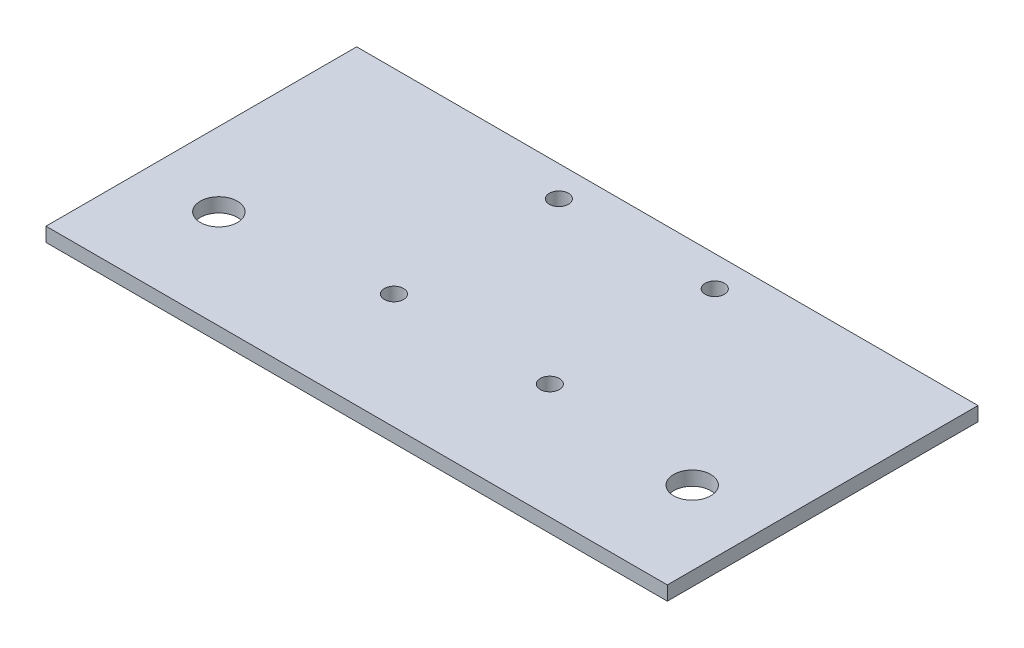
ISO-10303-21;
HEADER;
FILE_DESCRIPTION(('STEP AP214'),'2;1');
FILE_NAME('part.step','',(''),(''),'','','');
FILE_SCHEMA(('AUTOMOTIVE_DESIGN { 1 0 10303 214 1 1 1 1 }'));
ENDSEC;
DATA;
#1=APPLICATION_CONTEXT('core data for automotive mechanical design processes');
#2=APPLICATION_PROTOCOL_DEFINITION('international standard','automotive_design',2000,#1);
#3=PRODUCT_CONTEXT('',#1,'mechanical');
#4=PRODUCT('Part','Part','',(#3));
#5=PRODUCT_RELATED_PRODUCT_CATEGORY('part','',(#4));
#6=PRODUCT_DEFINITION_FORMATION('','',#4);
#7=PRODUCT_DEFINITION_CONTEXT('part definition',#1,'design');
#8=PRODUCT_DEFINITION('design','',#6,#7);
#9=PRODUCT_DEFINITION_SHAPE('','',#8);
#10=(LENGTH_UNIT() NAMED_UNIT(*) SI_UNIT(.MILLI.,.METRE.));
#11=(NAMED_UNIT(*) PLANE_ANGLE_UNIT() SI_UNIT($,.RADIAN.));
#12=(NAMED_UNIT(*) SI_UNIT($,.STERADIAN.) SOLID_ANGLE_UNIT());
#13=UNCERTAINTY_MEASURE_WITH_UNIT(LENGTH_MEASURE(1.E-05),#10,'distance_accuracy_value','');
#14=(GEOMETRIC_REPRESENTATION_CONTEXT(3) GLOBAL_UNCERTAINTY_ASSIGNED_CONTEXT((#13)) GLOBAL_UNIT_ASSIGNED_CONTEXT((#10,
#11,#12)) REPRESENTATION_CONTEXT('',''));
#15=CARTESIAN_POINT('',(0.,0.,0.));
#16=DIRECTION('',(0.,0.,1.));
#17=DIRECTION('',(1.,0.,0.));
#18=AXIS2_PLACEMENT_3D('',#15,#16,#17);
#19=CARTESIAN_POINT('',(0.,3.175,0.));
#20=DIRECTION('',(0.,1.,0.));
#21=DIRECTION('',(0.,0.,1.));
#22=AXIS2_PLACEMENT_3D('',#19,#20,#21);
#23=PLANE('',#22);
#24=CARTESIAN_POINT('',(-35.687,3.175,40.767));
#25=DIRECTION('',(0.,1.,0.));
#26=DIRECTION('',(0.,0.,1.));
#27=AXIS2_PLACEMENT_3D('',#24,#25,#26);
#28=CIRCLE('',#27,4.1656);
#29=CARTESIAN_POINT('',(-35.687,3.175,44.9326));
#30=VERTEX_POINT('',#29);
#31=EDGE_CURVE('E137',#30,#30,#28,.T.);
#32=ORIENTED_EDGE('',*,*,#31,.F.);
#33=EDGE_LOOP('',(#32));
#34=FACE_BOUND('',#33,.T.);
#35=CARTESIAN_POINT('',(0.,3.175,37.084));
#36=DIRECTION('',(0.,1.,0.));
#37=DIRECTION('',(0.,0.,1.));
#38=AXIS2_PLACEMENT_3D('',#35,#36,#37);
#39=CIRCLE('',#38,2.159);
#40=CARTESIAN_POINT('',(0.,3.175,39.243));
#41=VERTEX_POINT('',#40);
#42=EDGE_CURVE('E125',#41,#41,#39,.T.);
#43=ORIENTED_EDGE('',*,*,#42,.F.);
#44=EDGE_LOOP('',(#43));
#45=FACE_BOUND('',#44,.T.);
#46=CARTESIAN_POINT('',(0.,3.175,0.));
#47=DIRECTION('',(0.,1.,0.));
#48=DIRECTION('',(0.,0.,1.));
#49=AXIS2_PLACEMENT_3D('',#46,#47,#48);
#50=CIRCLE('',#49,2.159);
#51=CARTESIAN_POINT('',(0.,3.175,2.159));
#52=VERTEX_POINT('',#51);
#53=EDGE_CURVE('E104',#52,#52,#50,.T.);
#54=ORIENTED_EDGE('',*,*,#53,.F.);
#55=EDGE_LOOP('',(#54));
#56=FACE_BOUND('',#55,.T.);
#57=DIRECTION('',(0.,0.,1.));
#58=VECTOR('',#57,1.);
#59=CARTESIAN_POINT('',(-52.324,3.175,-6.858));
#60=LINE('',#59,#58);
#61=CARTESIAN_POINT('',(-52.324,3.175,-6.858));
#62=VERTEX_POINT('',#61);
#63=CARTESIAN_POINT('',(-52.324,3.175,62.992));
#64=VERTEX_POINT('',#63);
#65=EDGE_CURVE('E89',#62,#64,#60,.T.);
#66=ORIENTED_EDGE('',*,*,#65,.T.);
#67=DIRECTION('',(1.,0.,0.));
#68=VECTOR('',#67,1.);
#69=CARTESIAN_POINT('',(-52.324,3.175,62.992));
#70=LINE('',#69,#68);
#71=CARTESIAN_POINT('',(87.376,3.175,62.992));
#72=VERTEX_POINT('',#71);
#73=EDGE_CURVE('E84',#64,#72,#70,.T.);
#74=ORIENTED_EDGE('',*,*,#73,.T.);
#75=DIRECTION('',(0.,0.,-1.));
#76=VECTOR('',#75,1.);
#77=CARTESIAN_POINT('',(87.376,3.175,-6.858));
#78=LINE('',#77,#76);
#79=CARTESIAN_POINT('',(87.376,3.175,-6.858));
#80=VERTEX_POINT('',#79);
#81=EDGE_CURVE('E87',#72,#80,#78,.T.);
#82=ORIENTED_EDGE('',*,*,#81,.T.);
#83=DIRECTION('',(-1.,0.,0.));
#84=VECTOR('',#83,1.);
#85=CARTESIAN_POINT('',(-52.324,3.175,-6.858));
#86=LINE('',#85,#84);
#87=EDGE_CURVE('E54',#80,#62,#86,.T.);
#88=ORIENTED_EDGE('',*,*,#87,.T.);
#89=EDGE_LOOP('',(#66,#74,#82,#88));
#90=FACE_BOUND('',#89,.T.);
#91=CARTESIAN_POINT('',(35.052,3.175,0.));
#92=DIRECTION('',(0.,1.,0.));
#93=DIRECTION('',(0.,0.,1.));
#94=AXIS2_PLACEMENT_3D('',#91,#92,#93);
#95=CIRCLE('',#94,2.159);
#96=CARTESIAN_POINT('',(35.052,3.175,2.159));
#97=VERTEX_POINT('',#96);
#98=EDGE_CURVE('E119',#97,#97,#95,.T.);
#99=ORIENTED_EDGE('',*,*,#98,.F.);
#100=EDGE_LOOP('',(#99));
#101=FACE_BOUND('',#100,.T.);
#102=CARTESIAN_POINT('',(35.052,3.175,37.084));
#103=DIRECTION('',(0.,1.,0.));
#104=DIRECTION('',(0.,0.,1.));
#105=AXIS2_PLACEMENT_3D('',#102,#103,#104);
#106=CIRCLE('',#105,2.159);
#107=CARTESIAN_POINT('',(35.052,3.175,39.243));
#108=VERTEX_POINT('',#107);
#109=EDGE_CURVE('E131',#108,#108,#106,.T.);
#110=ORIENTED_EDGE('',*,*,#109,.F.);
#111=EDGE_LOOP('',(#110));
#112=FACE_BOUND('',#111,.T.);
#113=CARTESIAN_POINT('',(70.739,3.175,40.767));
#114=DIRECTION('',(0.,1.,0.));
#115=DIRECTION('',(0.,0.,1.));
#116=AXIS2_PLACEMENT_3D('',#113,#114,#115);
#117=CIRCLE('',#116,4.1656);
#118=CARTESIAN_POINT('',(70.739,3.175,44.9326));
#119=VERTEX_POINT('',#118);
#120=EDGE_CURVE('E143',#119,#119,#117,.T.);
#121=ORIENTED_EDGE('',*,*,#120,.F.);
#122=EDGE_LOOP('',(#121));
#123=FACE_BOUND('',#122,.T.);
#124=ADVANCED_FACE('F37',(#34,#45,#56,#90,#101,#112,#123),#23,.T.);
#125=CARTESIAN_POINT('',(0.,0.,0.));
#126=DIRECTION('',(0.,1.,0.));
#127=DIRECTION('',(0.,0.,1.));
#128=AXIS2_PLACEMENT_3D('',#125,#126,#127);
#129=PLANE('',#128);
#130=DIRECTION('',(0.,0.,1.));
#131=VECTOR('',#130,1.);
#132=CARTESIAN_POINT('',(-52.324,0.,-6.858));
#133=LINE('',#132,#131);
#134=CARTESIAN_POINT('',(-52.324,0.,-6.858));
#135=VERTEX_POINT('',#134);
#136=CARTESIAN_POINT('',(-52.324,0.,62.992));
#137=VERTEX_POINT('',#136);
#138=EDGE_CURVE('E101',#135,#137,#133,.T.);
#139=ORIENTED_EDGE('',*,*,#138,.F.);
#140=DIRECTION('',(-1.,0.,0.));
#141=VECTOR('',#140,1.);
#142=CARTESIAN_POINT('',(-52.324,0.,-6.858));
#143=LINE('',#142,#141);
#144=CARTESIAN_POINT('',(87.376,0.,-6.858));
#145=VERTEX_POINT('',#144);
#146=EDGE_CURVE('E77',#145,#135,#143,.T.);
#147=ORIENTED_EDGE('',*,*,#146,.F.);
#148=DIRECTION('',(0.,0.,-1.));
#149=VECTOR('',#148,1.);
#150=CARTESIAN_POINT('',(87.376,0.,-6.858));
#151=LINE('',#150,#149);
#152=CARTESIAN_POINT('',(87.376,0.,62.992));
#153=VERTEX_POINT('',#152);
#154=EDGE_CURVE('E71',#153,#145,#151,.T.);
#155=ORIENTED_EDGE('',*,*,#154,.F.);
#156=DIRECTION('',(1.,0.,0.));
#157=VECTOR('',#156,1.);
#158=CARTESIAN_POINT('',(-52.324,0.,62.992));
#159=LINE('',#158,#157);
#160=EDGE_CURVE('E93',#137,#153,#159,.T.);
#161=ORIENTED_EDGE('',*,*,#160,.F.);
#162=EDGE_LOOP('',(#139,#147,#155,#161));
#163=FACE_BOUND('',#162,.T.);
#164=CARTESIAN_POINT('',(0.,0.,0.));
#165=DIRECTION('',(0.,1.,0.));
#166=DIRECTION('',(0.,0.,1.));
#167=AXIS2_PLACEMENT_3D('',#164,#165,#166);
#168=CIRCLE('',#167,2.159);
#169=CARTESIAN_POINT('',(0.,0.,2.159));
#170=VERTEX_POINT('',#169);
#171=EDGE_CURVE('E116',#170,#170,#168,.T.);
#172=ORIENTED_EDGE('',*,*,#171,.T.);
#173=EDGE_LOOP('',(#172));
#174=FACE_BOUND('',#173,.T.);
#175=CARTESIAN_POINT('',(35.052,0.,0.));
#176=DIRECTION('',(0.,1.,0.));
#177=DIRECTION('',(0.,0.,1.));
#178=AXIS2_PLACEMENT_3D('',#175,#176,#177);
#179=CIRCLE('',#178,2.159);
#180=CARTESIAN_POINT('',(35.052,0.,2.159));
#181=VERTEX_POINT('',#180);
#182=EDGE_CURVE('E122',#181,#181,#179,.T.);
#183=ORIENTED_EDGE('',*,*,#182,.T.);
#184=EDGE_LOOP('',(#183));
#185=FACE_BOUND('',#184,.T.);
#186=CARTESIAN_POINT('',(0.,0.,37.084));
#187=DIRECTION('',(0.,1.,0.));
#188=DIRECTION('',(0.,0.,1.));
#189=AXIS2_PLACEMENT_3D('',#186,#187,#188);
#190=CIRCLE('',#189,2.159);
#191=CARTESIAN_POINT('',(0.,0.,39.243));
#192=VERTEX_POINT('',#191);
#193=EDGE_CURVE('E128',#192,#192,#190,.T.);
#194=ORIENTED_EDGE('',*,*,#193,.T.);
#195=EDGE_LOOP('',(#194));
#196=FACE_BOUND('',#195,.T.);
#197=CARTESIAN_POINT('',(35.052,0.,37.084));
#198=DIRECTION('',(0.,1.,0.));
#199=DIRECTION('',(0.,0.,1.));
#200=AXIS2_PLACEMENT_3D('',#197,#198,#199);
#201=CIRCLE('',#200,2.159);
#202=CARTESIAN_POINT('',(35.052,0.,39.243));
#203=VERTEX_POINT('',#202);
#204=EDGE_CURVE('E134',#203,#203,#201,.T.);
#205=ORIENTED_EDGE('',*,*,#204,.T.);
#206=EDGE_LOOP('',(#205));
#207=FACE_BOUND('',#206,.T.);
#208=CARTESIAN_POINT('',(-35.687,0.,40.767));
#209=DIRECTION('',(0.,1.,0.));
#210=DIRECTION('',(0.,0.,1.));
#211=AXIS2_PLACEMENT_3D('',#208,#209,#210);
#212=CIRCLE('',#211,4.1656);
#213=CARTESIAN_POINT('',(-35.687,0.,44.9326));
#214=VERTEX_POINT('',#213);
#215=EDGE_CURVE('E140',#214,#214,#212,.T.);
#216=ORIENTED_EDGE('',*,*,#215,.T.);
#217=EDGE_LOOP('',(#216));
#218=FACE_BOUND('',#217,.T.);
#219=CARTESIAN_POINT('',(70.739,0.,40.767));
#220=DIRECTION('',(0.,1.,0.));
#221=DIRECTION('',(0.,0.,1.));
#222=AXIS2_PLACEMENT_3D('',#219,#220,#221);
#223=CIRCLE('',#222,4.1656);
#224=CARTESIAN_POINT('',(70.739,0.,44.9326));
#225=VERTEX_POINT('',#224);
#226=EDGE_CURVE('E146',#225,#225,#223,.T.);
#227=ORIENTED_EDGE('',*,*,#226,.T.);
#228=EDGE_LOOP('',(#227));
#229=FACE_BOUND('',#228,.T.);
#230=ADVANCED_FACE('F112',(#163,#174,#185,#196,#207,#218,#229),#129,.F.);
#231=CARTESIAN_POINT('',(-52.324,3.175,-6.858));
#232=DIRECTION('',(1.,0.,0.));
#233=DIRECTION('',(0.,0.,-1.));
#234=AXIS2_PLACEMENT_3D('',#231,#232,#233);
#235=PLANE('',#234);
#236=ORIENTED_EDGE('',*,*,#138,.T.);
#237=DIRECTION('',(0.,-1.,0.));
#238=VECTOR('',#237,1.);
#239=CARTESIAN_POINT('',(-52.324,3.175,62.992));
#240=LINE('',#239,#238);
#241=EDGE_CURVE('E11',#64,#137,#240,.T.);
#242=ORIENTED_EDGE('',*,*,#241,.F.);
#243=ORIENTED_EDGE('',*,*,#65,.F.);
#244=DIRECTION('',(0.,-1.,0.));
#245=VECTOR('',#244,1.);
#246=CARTESIAN_POINT('',(-52.324,3.175,-6.858));
#247=LINE('',#246,#245);
#248=EDGE_CURVE('E97',#62,#135,#247,.T.);
#249=ORIENTED_EDGE('',*,*,#248,.T.);
#250=EDGE_LOOP('',(#236,#242,#243,#249));
#251=FACE_BOUND('',#250,.T.);
#252=ADVANCED_FACE('F39',(#251),#235,.F.);
#253=CARTESIAN_POINT('',(-52.324,3.175,62.992));
#254=DIRECTION('',(0.,0.,-1.));
#255=DIRECTION('',(-1.,0.,0.));
#256=AXIS2_PLACEMENT_3D('',#253,#254,#255);
#257=PLANE('',#256);
#258=ORIENTED_EDGE('',*,*,#160,.T.);
#259=DIRECTION('',(0.,-1.,0.));
#260=VECTOR('',#259,1.);
#261=CARTESIAN_POINT('',(87.376,3.175,62.992));
#262=LINE('',#261,#260);
#263=EDGE_CURVE('E46',#72,#153,#262,.T.);
#264=ORIENTED_EDGE('',*,*,#263,.F.);
#265=ORIENTED_EDGE('',*,*,#73,.F.);
#266=ORIENTED_EDGE('',*,*,#241,.T.);
#267=EDGE_LOOP('',(#258,#264,#265,#266));
#268=FACE_BOUND('',#267,.T.);
#269=ADVANCED_FACE('F92',(#268),#257,.F.);
#270=CARTESIAN_POINT('',(87.376,3.175,-6.858));
#271=DIRECTION('',(-1.,0.,0.));
#272=DIRECTION('',(0.,0.,1.));
#273=AXIS2_PLACEMENT_3D('',#270,#271,#272);
#274=PLANE('',#273);
#275=ORIENTED_EDGE('',*,*,#154,.T.);
#276=DIRECTION('',(0.,-1.,0.));
#277=VECTOR('',#276,1.);
#278=CARTESIAN_POINT('',(87.376,3.175,-6.858));
#279=LINE('',#278,#277);
#280=EDGE_CURVE('E94',#80,#145,#279,.T.);
#281=ORIENTED_EDGE('',*,*,#280,.F.);
#282=ORIENTED_EDGE('',*,*,#81,.F.);
#283=ORIENTED_EDGE('',*,*,#263,.T.);
#284=EDGE_LOOP('',(#275,#281,#282,#283));
#285=FACE_BOUND('',#284,.T.);
#286=ADVANCED_FACE('F95',(#285),#274,.F.);
#287=CARTESIAN_POINT('',(-52.324,3.175,-6.858));
#288=DIRECTION('',(0.,0.,1.));
#289=DIRECTION('',(1.,0.,0.));
#290=AXIS2_PLACEMENT_3D('',#287,#288,#289);
#291=PLANE('',#290);
#292=ORIENTED_EDGE('',*,*,#146,.T.);
#293=ORIENTED_EDGE('',*,*,#248,.F.);
#294=ORIENTED_EDGE('',*,*,#87,.F.);
#295=ORIENTED_EDGE('',*,*,#280,.T.);
#296=EDGE_LOOP('',(#292,#293,#294,#295));
#297=FACE_BOUND('',#296,.T.);
#298=ADVANCED_FACE('F109',(#297),#291,.F.);
#299=CARTESIAN_POINT('',(0.,3.175,0.));
#300=DIRECTION('',(0.,-1.,0.));
#301=DIRECTION('',(0.,0.,-1.));
#302=AXIS2_PLACEMENT_3D('',#299,#300,#301);
#303=CYLINDRICAL_SURFACE('',#302,2.159);
#304=ORIENTED_EDGE('',*,*,#53,.T.);
#305=EDGE_LOOP('',(#304));
#306=FACE_BOUND('',#305,.T.);
#307=ORIENTED_EDGE('',*,*,#171,.F.);
#308=EDGE_LOOP('',(#307));
#309=FACE_BOUND('',#308,.T.);
#310=ADVANCED_FACE('F165',(#306,#309),#303,.F.);
#311=CARTESIAN_POINT('',(35.052,3.175,0.));
#312=DIRECTION('',(0.,-1.,0.));
#313=DIRECTION('',(0.,0.,-1.));
#314=AXIS2_PLACEMENT_3D('',#311,#312,#313);
#315=CYLINDRICAL_SURFACE('',#314,2.159);
#316=ORIENTED_EDGE('',*,*,#98,.T.);
#317=EDGE_LOOP('',(#316));
#318=FACE_BOUND('',#317,.T.);
#319=ORIENTED_EDGE('',*,*,#182,.F.);
#320=EDGE_LOOP('',(#319));
#321=FACE_BOUND('',#320,.T.);
#322=ADVANCED_FACE('F219',(#318,#321),#315,.F.);
#323=CARTESIAN_POINT('',(0.,3.175,37.084));
#324=DIRECTION('',(0.,-1.,0.));
#325=DIRECTION('',(0.,0.,-1.));
#326=AXIS2_PLACEMENT_3D('',#323,#324,#325);
#327=CYLINDRICAL_SURFACE('',#326,2.159);
#328=ORIENTED_EDGE('',*,*,#42,.T.);
#329=EDGE_LOOP('',(#328));
#330=FACE_BOUND('',#329,.T.);
#331=ORIENTED_EDGE('',*,*,#193,.F.);
#332=EDGE_LOOP('',(#331));
#333=FACE_BOUND('',#332,.T.);
#334=ADVANCED_FACE('F228',(#330,#333),#327,.F.);
#335=CARTESIAN_POINT('',(35.052,3.175,37.084));
#336=DIRECTION('',(0.,-1.,0.));
#337=DIRECTION('',(0.,0.,-1.));
#338=AXIS2_PLACEMENT_3D('',#335,#336,#337);
#339=CYLINDRICAL_SURFACE('',#338,2.159);
#340=ORIENTED_EDGE('',*,*,#109,.T.);
#341=EDGE_LOOP('',(#340));
#342=FACE_BOUND('',#341,.T.);
#343=ORIENTED_EDGE('',*,*,#204,.F.);
#344=EDGE_LOOP('',(#343));
#345=FACE_BOUND('',#344,.T.);
#346=ADVANCED_FACE('F237',(#342,#345),#339,.F.);
#347=CARTESIAN_POINT('',(-35.687,3.175,40.767));
#348=DIRECTION('',(0.,-1.,0.));
#349=DIRECTION('',(0.,0.,-1.));
#350=AXIS2_PLACEMENT_3D('',#347,#348,#349);
#351=CYLINDRICAL_SURFACE('',#350,4.1656);
#352=ORIENTED_EDGE('',*,*,#31,.T.);
#353=EDGE_LOOP('',(#352));
#354=FACE_BOUND('',#353,.T.);
#355=ORIENTED_EDGE('',*,*,#215,.F.);
#356=EDGE_LOOP('',(#355));
#357=FACE_BOUND('',#356,.T.);
#358=ADVANCED_FACE('F247',(#354,#357),#351,.F.);
#359=CARTESIAN_POINT('',(70.739,3.175,40.767));
#360=DIRECTION('',(0.,-1.,0.));
#361=DIRECTION('',(0.,0.,-1.));
#362=AXIS2_PLACEMENT_3D('',#359,#360,#361);
#363=CYLINDRICAL_SURFACE('',#362,4.1656);
#364=ORIENTED_EDGE('',*,*,#120,.T.);
#365=EDGE_LOOP('',(#364));
#366=FACE_BOUND('',#365,.T.);
#367=ORIENTED_EDGE('',*,*,#226,.F.);
#368=EDGE_LOOP('',(#367));
#369=FACE_BOUND('',#368,.T.);
#370=ADVANCED_FACE('F152',(#366,#369),#363,.F.);
#371=CLOSED_SHELL('',(#124,#230,#252,#269,#286,#298,#310,#322,#334,#346,#358,#370));
#372=MANIFOLD_SOLID_BREP('B2',#371);
#373=ADVANCED_BREP_SHAPE_REPRESENTATION('',(#18,#372),#14);
#374=SHAPE_DEFINITION_REPRESENTATION(#9,#373);
ENDSEC;
END-ISO-10303-21;
